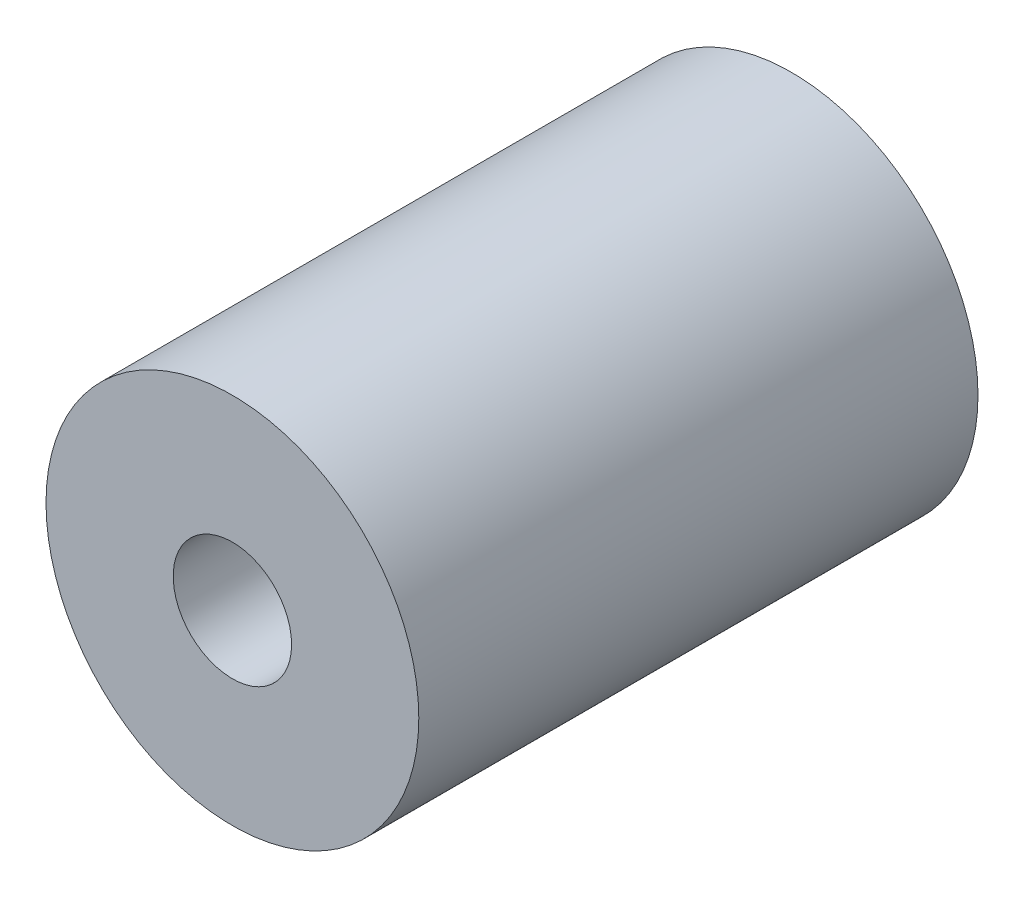
ISO-10303-21;
HEADER;
FILE_DESCRIPTION(('STEP AP214'),'2;1');
FILE_NAME('part.step','',(''),(''),'','','');
FILE_SCHEMA(('AUTOMOTIVE_DESIGN { 1 0 10303 214 1 1 1 1 }'));
ENDSEC;
DATA;
#1=APPLICATION_CONTEXT('core data for automotive mechanical design processes');
#2=APPLICATION_PROTOCOL_DEFINITION('international standard','automotive_design',2000,#1);
#3=PRODUCT_CONTEXT('',#1,'mechanical');
#4=PRODUCT('Part','Part','',(#3));
#5=PRODUCT_RELATED_PRODUCT_CATEGORY('part','',(#4));
#6=PRODUCT_DEFINITION_FORMATION('','',#4);
#7=PRODUCT_DEFINITION_CONTEXT('part definition',#1,'design');
#8=PRODUCT_DEFINITION('design','',#6,#7);
#9=PRODUCT_DEFINITION_SHAPE('','',#8);
#10=(LENGTH_UNIT() NAMED_UNIT(*) SI_UNIT(.MILLI.,.METRE.));
#11=(NAMED_UNIT(*) PLANE_ANGLE_UNIT() SI_UNIT($,.RADIAN.));
#12=(NAMED_UNIT(*) SI_UNIT($,.STERADIAN.) SOLID_ANGLE_UNIT());
#13=UNCERTAINTY_MEASURE_WITH_UNIT(LENGTH_MEASURE(1.E-05),#10,'distance_accuracy_value','');
#14=(GEOMETRIC_REPRESENTATION_CONTEXT(3) GLOBAL_UNCERTAINTY_ASSIGNED_CONTEXT((#13)) GLOBAL_UNIT_ASSIGNED_CONTEXT((#10,
#11,#12)) REPRESENTATION_CONTEXT('',''));
#15=CARTESIAN_POINT('',(0.,0.,0.));
#16=DIRECTION('',(0.,0.,1.));
#17=DIRECTION('',(1.,0.,0.));
#18=AXIS2_PLACEMENT_3D('',#15,#16,#17);
#19=CARTESIAN_POINT('',(0.,0.,30.));
#20=DIRECTION('',(0.,0.,1.));
#21=DIRECTION('',(1.,0.,0.));
#22=AXIS2_PLACEMENT_3D('',#19,#20,#21);
#23=PLANE('',#22);
#24=CARTESIAN_POINT('',(0.,0.,30.));
#25=DIRECTION('',(0.,0.,1.));
#26=DIRECTION('',(1.,0.,0.));
#27=AXIS2_PLACEMENT_3D('',#24,#25,#26);
#28=CIRCLE('',#27,10.);
#29=CARTESIAN_POINT('',(10.,0.,30.));
#30=VERTEX_POINT('',#29);
#31=EDGE_CURVE('E10',#30,#30,#28,.T.);
#32=ORIENTED_EDGE('',*,*,#31,.T.);
#33=EDGE_LOOP('',(#32));
#34=FACE_BOUND('',#33,.T.);
#35=CARTESIAN_POINT('',(0.,0.,30.));
#36=DIRECTION('',(0.,0.,1.));
#37=DIRECTION('',(1.,0.,0.));
#38=AXIS2_PLACEMENT_3D('',#35,#36,#37);
#39=CIRCLE('',#38,3.175);
#40=CARTESIAN_POINT('',(3.175,0.,30.));
#41=VERTEX_POINT('',#40);
#42=EDGE_CURVE('E42',#41,#41,#39,.T.);
#43=ORIENTED_EDGE('',*,*,#42,.F.);
#44=EDGE_LOOP('',(#43));
#45=FACE_BOUND('',#44,.T.);
#46=ADVANCED_FACE('F31',(#34,#45),#23,.T.);
#47=CARTESIAN_POINT('',(0.,0.,0.));
#48=DIRECTION('',(0.,0.,1.));
#49=DIRECTION('',(1.,0.,0.));
#50=AXIS2_PLACEMENT_3D('',#47,#48,#49);
#51=PLANE('',#50);
#52=CARTESIAN_POINT('',(0.,0.,0.));
#53=DIRECTION('',(0.,0.,1.));
#54=DIRECTION('',(1.,0.,0.));
#55=AXIS2_PLACEMENT_3D('',#52,#53,#54);
#56=CIRCLE('',#55,10.);
#57=CARTESIAN_POINT('',(10.,0.,0.));
#58=VERTEX_POINT('',#57);
#59=EDGE_CURVE('E35',#58,#58,#56,.T.);
#60=ORIENTED_EDGE('',*,*,#59,.F.);
#61=EDGE_LOOP('',(#60));
#62=FACE_BOUND('',#61,.T.);
#63=CARTESIAN_POINT('',(0.,0.,0.));
#64=DIRECTION('',(0.,0.,1.));
#65=DIRECTION('',(1.,0.,0.));
#66=AXIS2_PLACEMENT_3D('',#63,#64,#65);
#67=CIRCLE('',#66,3.175);
#68=CARTESIAN_POINT('',(3.175,0.,0.));
#69=VERTEX_POINT('',#68);
#70=EDGE_CURVE('E44',#69,#69,#67,.T.);
#71=ORIENTED_EDGE('',*,*,#70,.T.);
#72=EDGE_LOOP('',(#71));
#73=FACE_BOUND('',#72,.T.);
#74=ADVANCED_FACE('F54',(#62,#73),#51,.F.);
#75=CARTESIAN_POINT('',(0.,0.,30.));
#76=DIRECTION('',(0.,0.,-1.));
#77=DIRECTION('',(-1.,0.,0.));
#78=AXIS2_PLACEMENT_3D('',#75,#76,#77);
#79=CYLINDRICAL_SURFACE('',#78,10.);
#80=ORIENTED_EDGE('',*,*,#31,.F.);
#81=EDGE_LOOP('',(#80));
#82=FACE_BOUND('',#81,.T.);
#83=ORIENTED_EDGE('',*,*,#59,.T.);
#84=EDGE_LOOP('',(#83));
#85=FACE_BOUND('',#84,.T.);
#86=ADVANCED_FACE('F33',(#82,#85),#79,.T.);
#87=CARTESIAN_POINT('',(0.,0.,30.));
#88=DIRECTION('',(0.,0.,-1.));
#89=DIRECTION('',(-1.,0.,0.));
#90=AXIS2_PLACEMENT_3D('',#87,#88,#89);
#91=CYLINDRICAL_SURFACE('',#90,3.175);
#92=ORIENTED_EDGE('',*,*,#42,.T.);
#93=EDGE_LOOP('',(#92));
#94=FACE_BOUND('',#93,.T.);
#95=ORIENTED_EDGE('',*,*,#70,.F.);
#96=EDGE_LOOP('',(#95));
#97=FACE_BOUND('',#96,.T.);
#98=ADVANCED_FACE('F50',(#94,#97),#91,.F.);
#99=CLOSED_SHELL('',(#46,#74,#86,#98));
#100=MANIFOLD_SOLID_BREP('B2',#99);
#101=ADVANCED_BREP_SHAPE_REPRESENTATION('',(#18,#100),#14);
#102=SHAPE_DEFINITION_REPRESENTATION(#9,#101);
ENDSEC;
END-ISO-10303-21;
